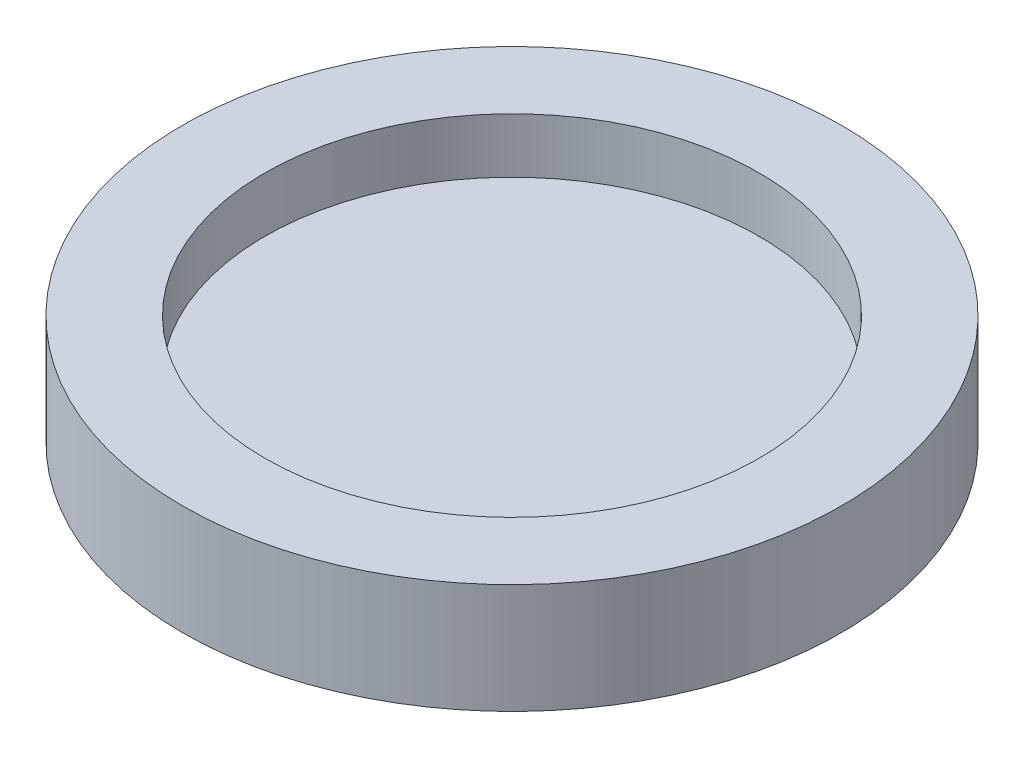
ISO-10303-21;
HEADER;
FILE_DESCRIPTION(('STEP AP214'),'2;1');
FILE_NAME('part.step','',(''),(''),'','','');
FILE_SCHEMA(('AUTOMOTIVE_DESIGN { 1 0 10303 214 1 1 1 1 }'));
ENDSEC;
DATA;
#1=APPLICATION_CONTEXT('core data for automotive mechanical design processes');
#2=APPLICATION_PROTOCOL_DEFINITION('international standard','automotive_design',2000,#1);
#3=PRODUCT_CONTEXT('',#1,'mechanical');
#4=PRODUCT('Part','Part','',(#3));
#5=PRODUCT_RELATED_PRODUCT_CATEGORY('part','',(#4));
#6=PRODUCT_DEFINITION_FORMATION('','',#4);
#7=PRODUCT_DEFINITION_CONTEXT('part definition',#1,'design');
#8=PRODUCT_DEFINITION('design','',#6,#7);
#9=PRODUCT_DEFINITION_SHAPE('','',#8);
#10=(LENGTH_UNIT() NAMED_UNIT(*) SI_UNIT(.MILLI.,.METRE.));
#11=(NAMED_UNIT(*) PLANE_ANGLE_UNIT() SI_UNIT($,.RADIAN.));
#12=(NAMED_UNIT(*) SI_UNIT($,.STERADIAN.) SOLID_ANGLE_UNIT());
#13=UNCERTAINTY_MEASURE_WITH_UNIT(LENGTH_MEASURE(1.E-05),#10,'distance_accuracy_value','');
#14=(GEOMETRIC_REPRESENTATION_CONTEXT(3) GLOBAL_UNCERTAINTY_ASSIGNED_CONTEXT((#13)) GLOBAL_UNIT_ASSIGNED_CONTEXT((#10,
#11,#12)) REPRESENTATION_CONTEXT('',''));
#15=CARTESIAN_POINT('',(0.,0.,0.));
#16=DIRECTION('',(0.,0.,1.));
#17=DIRECTION('',(1.,0.,0.));
#18=AXIS2_PLACEMENT_3D('',#15,#16,#17);
#19=CARTESIAN_POINT('',(0.,-20.,0.));
#20=DIRECTION('',(0.,1.,0.));
#21=DIRECTION('',(0.,0.,1.));
#22=AXIS2_PLACEMENT_3D('',#19,#20,#21);
#23=CYLINDRICAL_SURFACE('',#22,60.);
#24=CARTESIAN_POINT('',(0.,-20.,0.));
#25=DIRECTION('',(0.,1.,0.));
#26=DIRECTION('',(0.,0.,1.));
#27=AXIS2_PLACEMENT_3D('',#24,#25,#26);
#28=CIRCLE('',#27,60.);
#29=CARTESIAN_POINT('',(0.,-20.,60.));
#30=VERTEX_POINT('',#29);
#31=EDGE_CURVE('E10',#30,#30,#28,.T.);
#32=ORIENTED_EDGE('',*,*,#31,.T.);
#33=EDGE_LOOP('',(#32));
#34=FACE_BOUND('',#33,.T.);
#35=CARTESIAN_POINT('',(0.,0.,0.));
#36=DIRECTION('',(0.,1.,0.));
#37=DIRECTION('',(0.,0.,1.));
#38=AXIS2_PLACEMENT_3D('',#35,#36,#37);
#39=CIRCLE('',#38,60.);
#40=CARTESIAN_POINT('',(0.,0.,60.));
#41=VERTEX_POINT('',#40);
#42=EDGE_CURVE('E36',#41,#41,#39,.T.);
#43=ORIENTED_EDGE('',*,*,#42,.F.);
#44=EDGE_LOOP('',(#43));
#45=FACE_BOUND('',#44,.T.);
#46=ADVANCED_FACE('F33',(#34,#45),#23,.T.);
#47=CARTESIAN_POINT('',(0.,-20.,0.));
#48=DIRECTION('',(0.,1.,0.));
#49=DIRECTION('',(0.,0.,1.));
#50=AXIS2_PLACEMENT_3D('',#47,#48,#49);
#51=PLANE('',#50);
#52=ORIENTED_EDGE('',*,*,#31,.F.);
#53=EDGE_LOOP('',(#52));
#54=FACE_BOUND('',#53,.T.);
#55=ADVANCED_FACE('F62',(#54),#51,.F.);
#56=CARTESIAN_POINT('',(0.,0.,0.));
#57=DIRECTION('',(0.,1.,0.));
#58=DIRECTION('',(0.,0.,1.));
#59=AXIS2_PLACEMENT_3D('',#56,#57,#58);
#60=PLANE('',#59);
#61=CARTESIAN_POINT('',(0.,0.,0.));
#62=DIRECTION('',(0.,1.,0.));
#63=DIRECTION('',(0.,0.,1.));
#64=AXIS2_PLACEMENT_3D('',#61,#62,#63);
#65=CIRCLE('',#64,45.);
#66=CARTESIAN_POINT('',(0.,0.,45.));
#67=VERTEX_POINT('',#66);
#68=EDGE_CURVE('E45',#67,#67,#65,.T.);
#69=ORIENTED_EDGE('',*,*,#68,.F.);
#70=EDGE_LOOP('',(#69));
#71=FACE_BOUND('',#70,.T.);
#72=ORIENTED_EDGE('',*,*,#42,.T.);
#73=EDGE_LOOP('',(#72));
#74=FACE_BOUND('',#73,.T.);
#75=ADVANCED_FACE('F56',(#71,#74),#60,.T.);
#76=CARTESIAN_POINT('',(0.,-10.,0.));
#77=DIRECTION('',(0.,1.,0.));
#78=DIRECTION('',(0.,0.,1.));
#79=AXIS2_PLACEMENT_3D('',#76,#77,#78);
#80=CYLINDRICAL_SURFACE('',#79,45.);
#81=CARTESIAN_POINT('',(0.,-10.,0.));
#82=DIRECTION('',(0.,1.,0.));
#83=DIRECTION('',(0.,0.,1.));
#84=AXIS2_PLACEMENT_3D('',#81,#82,#83);
#85=CIRCLE('',#84,45.);
#86=CARTESIAN_POINT('',(0.,-10.,45.));
#87=VERTEX_POINT('',#86);
#88=EDGE_CURVE('E43',#87,#87,#85,.T.);
#89=ORIENTED_EDGE('',*,*,#88,.F.);
#90=EDGE_LOOP('',(#89));
#91=FACE_BOUND('',#90,.T.);
#92=ORIENTED_EDGE('',*,*,#68,.T.);
#93=EDGE_LOOP('',(#92));
#94=FACE_BOUND('',#93,.T.);
#95=ADVANCED_FACE('F53',(#91,#94),#80,.F.);
#96=CARTESIAN_POINT('',(0.,-10.,0.));
#97=DIRECTION('',(0.,1.,0.));
#98=DIRECTION('',(0.,0.,1.));
#99=AXIS2_PLACEMENT_3D('',#96,#97,#98);
#100=PLANE('',#99);
#101=ORIENTED_EDGE('',*,*,#88,.T.);
#102=EDGE_LOOP('',(#101));
#103=FACE_BOUND('',#102,.T.);
#104=ADVANCED_FACE('F51',(#103),#100,.T.);
#105=CLOSED_SHELL('',(#46,#55,#75,#95,#104));
#106=MANIFOLD_SOLID_BREP('B2',#105);
#107=ADVANCED_BREP_SHAPE_REPRESENTATION('',(#18,#106),#14);
#108=SHAPE_DEFINITION_REPRESENTATION(#9,#107);
ENDSEC;
END-ISO-10303-21;
